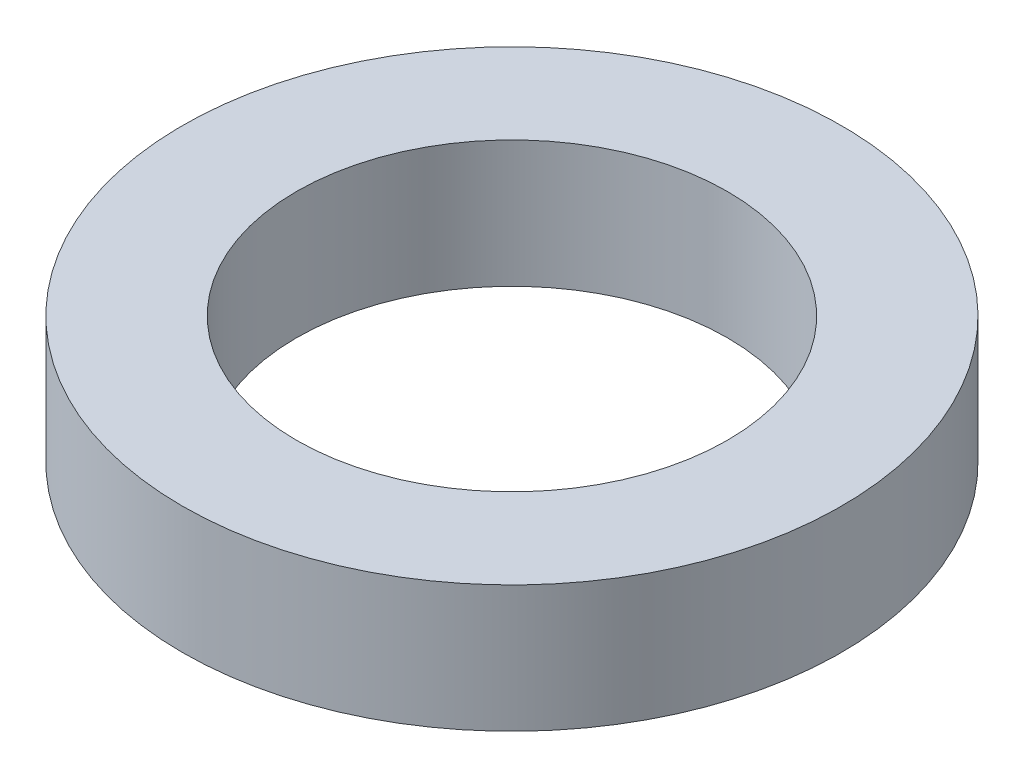
ISO-10303-21;
HEADER;
FILE_DESCRIPTION(('STEP AP214'),'2;1');
FILE_NAME('part.step','',(''),(''),'','','');
FILE_SCHEMA(('AUTOMOTIVE_DESIGN { 1 0 10303 214 1 1 1 1 }'));
ENDSEC;
DATA;
#1=APPLICATION_CONTEXT('core data for automotive mechanical design processes');
#2=APPLICATION_PROTOCOL_DEFINITION('international standard','automotive_design',2000,#1);
#3=PRODUCT_CONTEXT('',#1,'mechanical');
#4=PRODUCT('Part','Part','',(#3));
#5=PRODUCT_RELATED_PRODUCT_CATEGORY('part','',(#4));
#6=PRODUCT_DEFINITION_FORMATION('','',#4);
#7=PRODUCT_DEFINITION_CONTEXT('part definition',#1,'design');
#8=PRODUCT_DEFINITION('design','',#6,#7);
#9=PRODUCT_DEFINITION_SHAPE('','',#8);
#10=(LENGTH_UNIT() NAMED_UNIT(*) SI_UNIT(.MILLI.,.METRE.));
#11=(NAMED_UNIT(*) PLANE_ANGLE_UNIT() SI_UNIT($,.RADIAN.));
#12=(NAMED_UNIT(*) SI_UNIT($,.STERADIAN.) SOLID_ANGLE_UNIT());
#13=UNCERTAINTY_MEASURE_WITH_UNIT(LENGTH_MEASURE(1.E-05),#10,'distance_accuracy_value','');
#14=(GEOMETRIC_REPRESENTATION_CONTEXT(3) GLOBAL_UNCERTAINTY_ASSIGNED_CONTEXT((#13)) GLOBAL_UNIT_ASSIGNED_CONTEXT((#10,
#11,#12)) REPRESENTATION_CONTEXT('',''));
#15=CARTESIAN_POINT('',(0.,0.,0.));
#16=DIRECTION('',(0.,0.,1.));
#17=DIRECTION('',(1.,0.,0.));
#18=AXIS2_PLACEMENT_3D('',#15,#16,#17);
#19=CARTESIAN_POINT('',(0.,5.,0.));
#20=DIRECTION('',(0.,1.,0.));
#21=DIRECTION('',(0.,0.,1.));
#22=AXIS2_PLACEMENT_3D('',#19,#20,#21);
#23=PLANE('',#22);
#24=CARTESIAN_POINT('',(0.,5.,0.));
#25=DIRECTION('',(0.,1.,0.));
#26=DIRECTION('',(0.,0.,1.));
#27=AXIS2_PLACEMENT_3D('',#24,#25,#26);
#28=CIRCLE('',#27,13.);
#29=CARTESIAN_POINT('',(0.,5.,13.));
#30=VERTEX_POINT('',#29);
#31=EDGE_CURVE('E10',#30,#30,#28,.T.);
#32=ORIENTED_EDGE('',*,*,#31,.T.);
#33=EDGE_LOOP('',(#32));
#34=FACE_BOUND('',#33,.T.);
#35=CARTESIAN_POINT('',(0.,5.,0.));
#36=DIRECTION('',(0.,1.,0.));
#37=DIRECTION('',(0.,0.,1.));
#38=AXIS2_PLACEMENT_3D('',#35,#36,#37);
#39=CIRCLE('',#38,8.5);
#40=CARTESIAN_POINT('',(0.,5.,8.5));
#41=VERTEX_POINT('',#40);
#42=EDGE_CURVE('E48',#41,#41,#39,.T.);
#43=ORIENTED_EDGE('',*,*,#42,.F.);
#44=EDGE_LOOP('',(#43));
#45=FACE_BOUND('',#44,.T.);
#46=ADVANCED_FACE('F40',(#34,#45),#23,.T.);
#47=CARTESIAN_POINT('',(0.,0.,0.));
#48=DIRECTION('',(0.,1.,0.));
#49=DIRECTION('',(0.,0.,1.));
#50=AXIS2_PLACEMENT_3D('',#47,#48,#49);
#51=PLANE('',#50);
#52=CARTESIAN_POINT('',(0.,0.,0.));
#53=DIRECTION('',(0.,1.,0.));
#54=DIRECTION('',(0.,0.,1.));
#55=AXIS2_PLACEMENT_3D('',#52,#53,#54);
#56=CIRCLE('',#55,13.);
#57=CARTESIAN_POINT('',(0.,0.,13.));
#58=VERTEX_POINT('',#57);
#59=EDGE_CURVE('E41',#58,#58,#56,.T.);
#60=ORIENTED_EDGE('',*,*,#59,.F.);
#61=EDGE_LOOP('',(#60));
#62=FACE_BOUND('',#61,.T.);
#63=CARTESIAN_POINT('',(0.,0.,0.));
#64=DIRECTION('',(0.,1.,0.));
#65=DIRECTION('',(0.,0.,1.));
#66=AXIS2_PLACEMENT_3D('',#63,#64,#65);
#67=CIRCLE('',#66,8.5);
#68=CARTESIAN_POINT('',(0.,0.,8.5));
#69=VERTEX_POINT('',#68);
#70=EDGE_CURVE('E49',#69,#69,#67,.T.);
#71=ORIENTED_EDGE('',*,*,#70,.T.);
#72=EDGE_LOOP('',(#71));
#73=FACE_BOUND('',#72,.T.);
#74=ADVANCED_FACE('F58',(#62,#73),#51,.F.);
#75=CARTESIAN_POINT('',(0.,5.,0.));
#76=DIRECTION('',(0.,-1.,0.));
#77=DIRECTION('',(0.,0.,-1.));
#78=AXIS2_PLACEMENT_3D('',#75,#76,#77);
#79=CYLINDRICAL_SURFACE('',#78,13.);
#80=ORIENTED_EDGE('',*,*,#31,.F.);
#81=EDGE_LOOP('',(#80));
#82=FACE_BOUND('',#81,.T.);
#83=ORIENTED_EDGE('',*,*,#59,.T.);
#84=EDGE_LOOP('',(#83));
#85=FACE_BOUND('',#84,.T.);
#86=ADVANCED_FACE('F39',(#82,#85),#79,.T.);
#87=CARTESIAN_POINT('',(0.,5.,0.));
#88=DIRECTION('',(0.,-1.,0.));
#89=DIRECTION('',(0.,0.,-1.));
#90=AXIS2_PLACEMENT_3D('',#87,#88,#89);
#91=CYLINDRICAL_SURFACE('',#90,8.5);
#92=ORIENTED_EDGE('',*,*,#42,.T.);
#93=EDGE_LOOP('',(#92));
#94=FACE_BOUND('',#93,.T.);
#95=ORIENTED_EDGE('',*,*,#70,.F.);
#96=EDGE_LOOP('',(#95));
#97=FACE_BOUND('',#96,.T.);
#98=ADVANCED_FACE('F57',(#94,#97),#91,.F.);
#99=CLOSED_SHELL('',(#46,#74,#86,#98));
#100=MANIFOLD_SOLID_BREP('B2',#99);
#101=ADVANCED_BREP_SHAPE_REPRESENTATION('',(#18,#100),#14);
#102=SHAPE_DEFINITION_REPRESENTATION(#9,#101);
ENDSEC;
END-ISO-10303-21;
